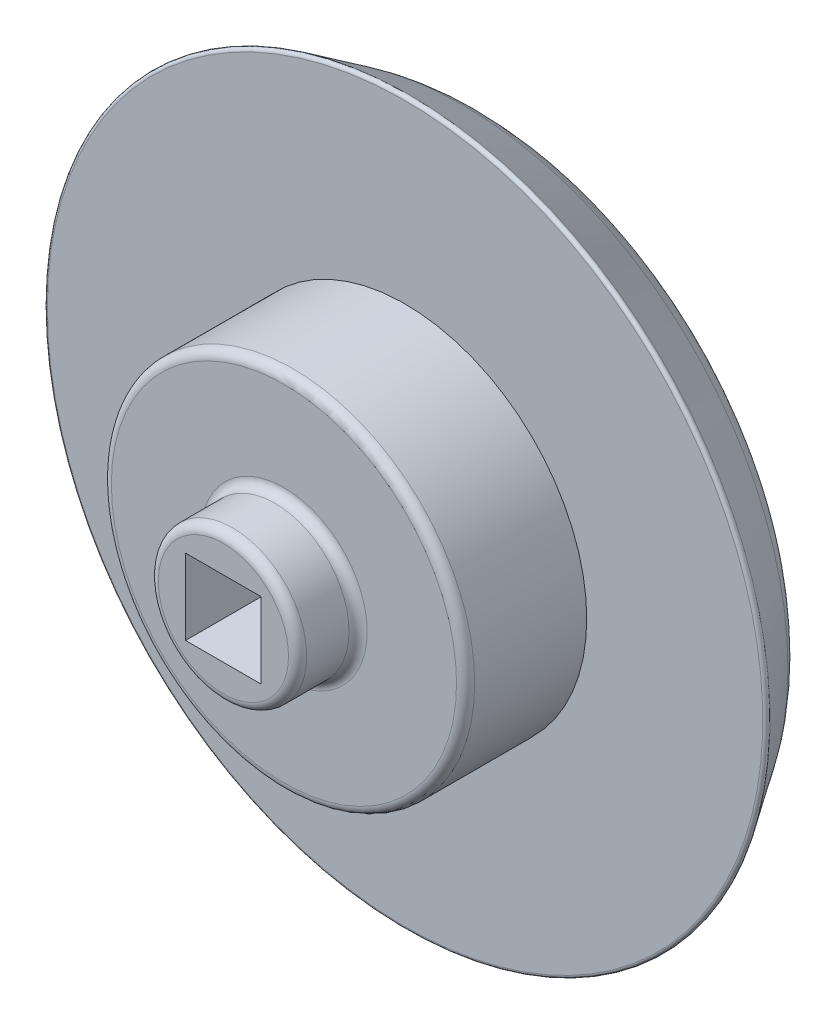
ISO-10303-21;
HEADER;
FILE_DESCRIPTION(('STEP AP214'),'2;1');
FILE_NAME('part.step','',(''),(''),'','','');
FILE_SCHEMA(('AUTOMOTIVE_DESIGN { 1 0 10303 214 1 1 1 1 }'));
ENDSEC;
DATA;
#1=APPLICATION_CONTEXT('core data for automotive mechanical design processes');
#2=APPLICATION_PROTOCOL_DEFINITION('international standard','automotive_design',2000,#1);
#3=PRODUCT_CONTEXT('',#1,'mechanical');
#4=PRODUCT('Part','Part','',(#3));
#5=PRODUCT_RELATED_PRODUCT_CATEGORY('part','',(#4));
#6=PRODUCT_DEFINITION_FORMATION('','',#4);
#7=PRODUCT_DEFINITION_CONTEXT('part definition',#1,'design');
#8=PRODUCT_DEFINITION('design','',#6,#7);
#9=PRODUCT_DEFINITION_SHAPE('','',#8);
#10=(LENGTH_UNIT() NAMED_UNIT(*) SI_UNIT(.MILLI.,.METRE.));
#11=(NAMED_UNIT(*) PLANE_ANGLE_UNIT() SI_UNIT($,.RADIAN.));
#12=(NAMED_UNIT(*) SI_UNIT($,.STERADIAN.) SOLID_ANGLE_UNIT());
#13=UNCERTAINTY_MEASURE_WITH_UNIT(LENGTH_MEASURE(1.E-05),#10,'distance_accuracy_value','');
#14=(GEOMETRIC_REPRESENTATION_CONTEXT(3) GLOBAL_UNCERTAINTY_ASSIGNED_CONTEXT((#13)) GLOBAL_UNIT_ASSIGNED_CONTEXT((#10,
#11,#12)) REPRESENTATION_CONTEXT('',''));
#15=CARTESIAN_POINT('',(0.,0.,0.));
#16=DIRECTION('',(0.,0.,1.));
#17=DIRECTION('',(1.,0.,0.));
#18=AXIS2_PLACEMENT_3D('',#15,#16,#17);
#19=CARTESIAN_POINT('',(25.4,0.,-5.68302158273383));
#20=DIRECTION('',(0.,0.,1.));
#21=DIRECTION('',(1.,0.,0.));
#22=AXIS2_PLACEMENT_3D('',#19,#20,#21);
#23=PLANE('',#22);
#24=CARTESIAN_POINT('',(0.,0.,-5.68302158273382));
#25=DIRECTION('',(0.,0.,1.));
#26=DIRECTION('',(1.,0.,0.));
#27=AXIS2_PLACEMENT_3D('',#24,#25,#26);
#28=CIRCLE('',#27,22.1375198082572);
#29=CARTESIAN_POINT('',(22.1375198082572,0.,-5.68302158273382));
#30=VERTEX_POINT('',#29);
#31=EDGE_CURVE('E124',#30,#30,#28,.F.);
#32=ORIENTED_EDGE('',*,*,#31,.T.);
#33=EDGE_LOOP('',(#32));
#34=FACE_BOUND('',#33,.T.);
#35=CARTESIAN_POINT('',(0.,0.,-5.68302158273382));
#36=DIRECTION('',(0.,0.,-1.));
#37=DIRECTION('',(-1.,0.,0.));
#38=AXIS2_PLACEMENT_3D('',#35,#36,#37);
#39=CIRCLE('',#38,12.7);
#40=CARTESIAN_POINT('',(-12.7,0.,-5.68302158273382));
#41=VERTEX_POINT('',#40);
#42=EDGE_CURVE('E113',#41,#41,#39,.T.);
#43=ORIENTED_EDGE('',*,*,#42,.F.);
#44=EDGE_LOOP('',(#43));
#45=FACE_BOUND('',#44,.T.);
#46=ADVANCED_FACE('F37',(#34,#45),#23,.F.);
#47=CARTESIAN_POINT('',(0.,0.,1.93697841726618));
#48=DIRECTION('',(0.,0.,-1.));
#49=DIRECTION('',(-1.,0.,0.));
#50=AXIS2_PLACEMENT_3D('',#47,#48,#49);
#51=PLANE('',#50);
#52=CARTESIAN_POINT('',(0.,0.,1.93697841726618));
#53=DIRECTION('',(0.,0.,-1.));
#54=DIRECTION('',(-1.,0.,0.));
#55=AXIS2_PLACEMENT_3D('',#52,#53,#54);
#56=CIRCLE('',#55,30.0053966586774);
#57=CARTESIAN_POINT('',(-30.0053966586774,0.,1.93697841726618));
#58=VERTEX_POINT('',#57);
#59=EDGE_CURVE('E11',#58,#58,#56,.F.);
#60=ORIENTED_EDGE('',*,*,#59,.T.);
#61=EDGE_LOOP('',(#60));
#62=FACE_BOUND('',#61,.T.);
#63=CARTESIAN_POINT('',(0.,0.,1.93697841726618));
#64=DIRECTION('',(0.,0.,1.));
#65=DIRECTION('',(1.,0.,0.));
#66=AXIS2_PLACEMENT_3D('',#63,#64,#65);
#67=CIRCLE('',#66,15.24);
#68=CARTESIAN_POINT('',(15.24,0.,1.93697841726618));
#69=VERTEX_POINT('',#68);
#70=EDGE_CURVE('E119',#69,#69,#67,.T.);
#71=ORIENTED_EDGE('',*,*,#70,.F.);
#72=EDGE_LOOP('',(#71));
#73=FACE_BOUND('',#72,.T.);
#74=ADVANCED_FACE('F167',(#62,#73),#51,.F.);
#75=CARTESIAN_POINT('',(0.,0.,1.93697841726618));
#76=DIRECTION('',(0.,0.,1.));
#77=DIRECTION('',(1.,0.,0.));
#78=AXIS2_PLACEMENT_3D('',#75,#76,#77);
#79=CONICAL_SURFACE('',#78,30.48,0.588002603547567);
#80=CARTESIAN_POINT('',(0.,0.,1.54208456742497));
#81=DIRECTION('',(0.,0.,-1.));
#82=DIRECTION('',(-1.,0.,0.));
#83=AXIS2_PLACEMENT_3D('',#80,#81,#82);
#84=CIRCLE('',#83,30.2167374334392);
#85=CARTESIAN_POINT('',(-30.2167374334392,0.,1.54208456742497));
#86=VERTEX_POINT('',#85);
#87=EDGE_CURVE('E45',#86,#86,#84,.T.);
#88=ORIENTED_EDGE('',*,*,#87,.T.);
#89=EDGE_LOOP('',(#88));
#90=FACE_BOUND('',#89,.T.);
#91=CARTESIAN_POINT('',(0.,0.,-2.96847397892282));
#92=DIRECTION('',(0.,0.,-1.));
#93=DIRECTION('',(-1.,0.,0.));
#94=AXIS2_PLACEMENT_3D('',#91,#92,#93);
#95=CIRCLE('',#94,27.2096984025407);
#96=CARTESIAN_POINT('',(-27.2096984025407,0.,-2.96847397892281));
#97=VERTEX_POINT('',#96);
#98=EDGE_CURVE('E127',#97,#97,#95,.F.);
#99=ORIENTED_EDGE('',*,*,#98,.T.);
#100=EDGE_LOOP('',(#99));
#101=FACE_BOUND('',#100,.T.);
#102=ADVANCED_FACE('F150',(#90,#101),#79,.T.);
#103=CARTESIAN_POINT('',(0.,0.,12.0969784172662));
#104=DIRECTION('',(0.,0.,-1.));
#105=DIRECTION('',(-1.,0.,0.));
#106=AXIS2_PLACEMENT_3D('',#103,#104,#105);
#107=CYLINDRICAL_SURFACE('',#106,15.24);
#108=CARTESIAN_POINT('',(0.,0.,11.3349784172662));
#109=DIRECTION('',(0.,0.,1.));
#110=DIRECTION('',(1.,0.,0.));
#111=AXIS2_PLACEMENT_3D('',#108,#109,#110);
#112=CIRCLE('',#111,15.24);
#113=CARTESIAN_POINT('',(15.24,0.,11.3349784172662));
#114=VERTEX_POINT('',#113);
#115=EDGE_CURVE('E145',#114,#114,#112,.F.);
#116=ORIENTED_EDGE('',*,*,#115,.T.);
#117=EDGE_LOOP('',(#116));
#118=FACE_BOUND('',#117,.T.);
#119=ORIENTED_EDGE('',*,*,#70,.T.);
#120=EDGE_LOOP('',(#119));
#121=FACE_BOUND('',#120,.T.);
#122=ADVANCED_FACE('F208',(#118,#121),#107,.T.);
#123=CARTESIAN_POINT('',(0.,0.,12.0969784172662));
#124=DIRECTION('',(0.,0.,1.));
#125=DIRECTION('',(1.,0.,0.));
#126=AXIS2_PLACEMENT_3D('',#123,#124,#125);
#127=PLANE('',#126);
#128=CARTESIAN_POINT('',(0.,0.,12.0969784172662));
#129=DIRECTION('',(0.,0.,1.));
#130=DIRECTION('',(1.,0.,0.));
#131=AXIS2_PLACEMENT_3D('',#128,#129,#130);
#132=CIRCLE('',#131,6.9860577826327);
#133=CARTESIAN_POINT('',(6.9860577826327,0.,12.0969784172662));
#134=VERTEX_POINT('',#133);
#135=EDGE_CURVE('E142',#134,#134,#132,.F.);
#136=ORIENTED_EDGE('',*,*,#135,.T.);
#137=EDGE_LOOP('',(#136));
#138=FACE_BOUND('',#137,.T.);
#139=CARTESIAN_POINT('',(0.,0.,12.0969784172662));
#140=DIRECTION('',(0.,0.,1.));
#141=DIRECTION('',(1.,0.,0.));
#142=AXIS2_PLACEMENT_3D('',#139,#140,#141);
#143=CIRCLE('',#142,14.478);
#144=CARTESIAN_POINT('',(14.478,0.,12.0969784172662));
#145=VERTEX_POINT('',#144);
#146=EDGE_CURVE('E139',#145,#145,#143,.T.);
#147=ORIENTED_EDGE('',*,*,#146,.T.);
#148=EDGE_LOOP('',(#147));
#149=FACE_BOUND('',#148,.T.);
#150=ADVANCED_FACE('F198',(#138,#149),#127,.T.);
#151=CARTESIAN_POINT('',(0.,0.,17.1769784172662));
#152=DIRECTION('',(0.,0.,-1.));
#153=DIRECTION('',(-1.,0.,0.));
#154=AXIS2_PLACEMENT_3D('',#151,#152,#153);
#155=CYLINDRICAL_SURFACE('',#154,6.2240577826327);
#156=CARTESIAN_POINT('',(0.,0.,16.4149784172662));
#157=DIRECTION('',(0.,0.,1.));
#158=DIRECTION('',(1.,0.,0.));
#159=AXIS2_PLACEMENT_3D('',#156,#157,#158);
#160=CIRCLE('',#159,6.2240577826327);
#161=CARTESIAN_POINT('',(6.2240577826327,0.,16.4149784172662));
#162=VERTEX_POINT('',#161);
#163=EDGE_CURVE('E136',#162,#162,#160,.F.);
#164=ORIENTED_EDGE('',*,*,#163,.T.);
#165=EDGE_LOOP('',(#164));
#166=FACE_BOUND('',#165,.T.);
#167=CARTESIAN_POINT('',(0.,0.,12.8589784172662));
#168=DIRECTION('',(0.,0.,1.));
#169=DIRECTION('',(1.,0.,0.));
#170=AXIS2_PLACEMENT_3D('',#167,#168,#169);
#171=CIRCLE('',#170,6.2240577826327);
#172=CARTESIAN_POINT('',(6.2240577826327,0.,12.8589784172662));
#173=VERTEX_POINT('',#172);
#174=EDGE_CURVE('E133',#173,#173,#171,.T.);
#175=ORIENTED_EDGE('',*,*,#174,.T.);
#176=EDGE_LOOP('',(#175));
#177=FACE_BOUND('',#176,.T.);
#178=ADVANCED_FACE('F195',(#166,#177),#155,.T.);
#179=CARTESIAN_POINT('',(0.,0.,17.1769784172662));
#180=DIRECTION('',(0.,0.,1.));
#181=DIRECTION('',(1.,0.,0.));
#182=AXIS2_PLACEMENT_3D('',#179,#180,#181);
#183=PLANE('',#182);
#184=DIRECTION('',(0.,-1.,0.));
#185=VECTOR('',#184,1.);
#186=CARTESIAN_POINT('',(-3.175,3.175,17.1769784172662));
#187=LINE('',#186,#185);
#188=CARTESIAN_POINT('',(-3.175,3.175,17.1769784172662));
#189=VERTEX_POINT('',#188);
#190=CARTESIAN_POINT('',(-3.175,-3.175,17.1769784172662));
#191=VERTEX_POINT('',#190);
#192=EDGE_CURVE('E52',#189,#191,#187,.T.);
#193=ORIENTED_EDGE('',*,*,#192,.F.);
#194=DIRECTION('',(-1.,0.,0.));
#195=VECTOR('',#194,1.);
#196=CARTESIAN_POINT('',(-3.175,3.175,17.1769784172662));
#197=LINE('',#196,#195);
#198=CARTESIAN_POINT('',(3.175,3.175,17.1769784172662));
#199=VERTEX_POINT('',#198);
#200=EDGE_CURVE('E103',#199,#189,#197,.T.);
#201=ORIENTED_EDGE('',*,*,#200,.F.);
#202=DIRECTION('',(0.,1.,0.));
#203=VECTOR('',#202,1.);
#204=CARTESIAN_POINT('',(3.175,3.175,17.1769784172662));
#205=LINE('',#204,#203);
#206=CARTESIAN_POINT('',(3.175,-3.175,17.1769784172662));
#207=VERTEX_POINT('',#206);
#208=EDGE_CURVE('E109',#207,#199,#205,.T.);
#209=ORIENTED_EDGE('',*,*,#208,.F.);
#210=DIRECTION('',(1.,0.,0.));
#211=VECTOR('',#210,1.);
#212=CARTESIAN_POINT('',(-3.175,-3.175,17.1769784172662));
#213=LINE('',#212,#211);
#214=EDGE_CURVE('E87',#191,#207,#213,.T.);
#215=ORIENTED_EDGE('',*,*,#214,.F.);
#216=EDGE_LOOP('',(#193,#201,#209,#215));
#217=FACE_BOUND('',#216,.T.);
#218=CARTESIAN_POINT('',(0.,0.,17.1769784172662));
#219=DIRECTION('',(0.,0.,1.));
#220=DIRECTION('',(1.,0.,0.));
#221=AXIS2_PLACEMENT_3D('',#218,#219,#220);
#222=CIRCLE('',#221,5.4620577826327);
#223=CARTESIAN_POINT('',(5.4620577826327,0.,17.1769784172662));
#224=VERTEX_POINT('',#223);
#225=EDGE_CURVE('E130',#224,#224,#222,.T.);
#226=ORIENTED_EDGE('',*,*,#225,.T.);
#227=EDGE_LOOP('',(#226));
#228=FACE_BOUND('',#227,.T.);
#229=ADVANCED_FACE('F197',(#217,#228),#183,.T.);
#230=CARTESIAN_POINT('',(0.,0.,-0.603021582733823));
#231=DIRECTION('',(0.,0.,-1.));
#232=DIRECTION('',(-1.,0.,0.));
#233=AXIS2_PLACEMENT_3D('',#230,#231,#232);
#234=CYLINDRICAL_SURFACE('',#233,12.7);
#235=CARTESIAN_POINT('',(0.,0.,-0.603021582733823));
#236=DIRECTION('',(0.,0.,-1.));
#237=DIRECTION('',(-1.,0.,0.));
#238=AXIS2_PLACEMENT_3D('',#235,#236,#237);
#239=CIRCLE('',#238,12.7);
#240=CARTESIAN_POINT('',(-12.7,0.,-0.603021582733823));
#241=VERTEX_POINT('',#240);
#242=EDGE_CURVE('E116',#241,#241,#239,.T.);
#243=ORIENTED_EDGE('',*,*,#242,.F.);
#244=EDGE_LOOP('',(#243));
#245=FACE_BOUND('',#244,.T.);
#246=ORIENTED_EDGE('',*,*,#42,.T.);
#247=EDGE_LOOP('',(#246));
#248=FACE_BOUND('',#247,.T.);
#249=ADVANCED_FACE('F205',(#245,#248),#234,.F.);
#250=CARTESIAN_POINT('',(0.,0.,-0.603021582733823));
#251=DIRECTION('',(0.,0.,-1.));
#252=DIRECTION('',(-1.,0.,0.));
#253=AXIS2_PLACEMENT_3D('',#250,#251,#252);
#254=PLANE('',#253);
#255=ORIENTED_EDGE('',*,*,#242,.T.);
#256=EDGE_LOOP('',(#255));
#257=FACE_BOUND('',#256,.T.);
#258=ADVANCED_FACE('F182',(#257),#254,.T.);
#259=CARTESIAN_POINT('',(0.,0.,0.412978417266177));
#260=DIRECTION('',(0.,0.,1.));
#261=DIRECTION('',(1.,0.,0.));
#262=AXIS2_PLACEMENT_3D('',#259,#260,#261);
#263=TOROIDAL_SURFACE('',#262,22.1375198082572,6.096);
#264=ORIENTED_EDGE('',*,*,#98,.F.);
#265=EDGE_LOOP('',(#264));
#266=FACE_BOUND('',#265,.T.);
#267=ORIENTED_EDGE('',*,*,#31,.F.);
#268=EDGE_LOOP('',(#267));
#269=FACE_BOUND('',#268,.T.);
#270=ADVANCED_FACE('F178',(#266,#269),#263,.T.);
#271=CARTESIAN_POINT('',(0.,0.,16.4149784172662));
#272=DIRECTION('',(0.,0.,1.));
#273=DIRECTION('',(1.,0.,0.));
#274=AXIS2_PLACEMENT_3D('',#271,#272,#273);
#275=TOROIDAL_SURFACE('',#274,5.4620577826327,0.762);
#276=ORIENTED_EDGE('',*,*,#163,.F.);
#277=EDGE_LOOP('',(#276));
#278=FACE_BOUND('',#277,.T.);
#279=ORIENTED_EDGE('',*,*,#225,.F.);
#280=EDGE_LOOP('',(#279));
#281=FACE_BOUND('',#280,.T.);
#282=ADVANCED_FACE('F181',(#278,#281),#275,.T.);
#283=CARTESIAN_POINT('',(0.,0.,12.8589784172662));
#284=DIRECTION('',(0.,0.,1.));
#285=DIRECTION('',(1.,0.,0.));
#286=AXIS2_PLACEMENT_3D('',#283,#284,#285);
#287=TOROIDAL_SURFACE('',#286,6.9860577826327,0.762);
#288=ORIENTED_EDGE('',*,*,#135,.F.);
#289=EDGE_LOOP('',(#288));
#290=FACE_BOUND('',#289,.T.);
#291=ORIENTED_EDGE('',*,*,#174,.F.);
#292=EDGE_LOOP('',(#291));
#293=FACE_BOUND('',#292,.T.);
#294=ADVANCED_FACE('F163',(#290,#293),#287,.F.);
#295=CARTESIAN_POINT('',(0.,0.,11.3349784172662));
#296=DIRECTION('',(0.,0.,1.));
#297=DIRECTION('',(1.,0.,0.));
#298=AXIS2_PLACEMENT_3D('',#295,#296,#297);
#299=TOROIDAL_SURFACE('',#298,14.478,0.762);
#300=ORIENTED_EDGE('',*,*,#115,.F.);
#301=EDGE_LOOP('',(#300));
#302=FACE_BOUND('',#301,.T.);
#303=ORIENTED_EDGE('',*,*,#146,.F.);
#304=EDGE_LOOP('',(#303));
#305=FACE_BOUND('',#304,.T.);
#306=ADVANCED_FACE('F155',(#302,#305),#299,.T.);
#307=CARTESIAN_POINT('',(0.,0.,1.68297841726618));
#308=DIRECTION('',(0.,0.,-1.));
#309=DIRECTION('',(-1.,0.,0.));
#310=AXIS2_PLACEMENT_3D('',#307,#308,#309);
#311=TOROIDAL_SURFACE('',#310,30.0053966586774,0.254);
#312=ORIENTED_EDGE('',*,*,#59,.F.);
#313=EDGE_LOOP('',(#312));
#314=FACE_BOUND('',#313,.T.);
#315=ORIENTED_EDGE('',*,*,#87,.F.);
#316=EDGE_LOOP('',(#315));
#317=FACE_BOUND('',#316,.T.);
#318=ADVANCED_FACE('F39',(#314,#317),#311,.T.);
#319=CARTESIAN_POINT('',(-3.175,3.175,6.17697841726618));
#320=DIRECTION('',(-1.,0.,0.));
#321=DIRECTION('',(0.,-1.,0.));
#322=AXIS2_PLACEMENT_3D('',#319,#320,#321);
#323=PLANE('',#322);
#324=ORIENTED_EDGE('',*,*,#192,.T.);
#325=DIRECTION('',(0.,0.,1.));
#326=VECTOR('',#325,1.);
#327=CARTESIAN_POINT('',(-3.175,-3.175,6.17697841726618));
#328=LINE('',#327,#326);
#329=CARTESIAN_POINT('',(-3.175,-3.175,6.17697841726618));
#330=VERTEX_POINT('',#329);
#331=EDGE_CURVE('E75',#330,#191,#328,.T.);
#332=ORIENTED_EDGE('',*,*,#331,.F.);
#333=DIRECTION('',(0.,-1.,0.));
#334=VECTOR('',#333,1.);
#335=CARTESIAN_POINT('',(-3.175,3.175,6.17697841726618));
#336=LINE('',#335,#334);
#337=CARTESIAN_POINT('',(-3.175,3.175,6.17697841726618));
#338=VERTEX_POINT('',#337);
#339=EDGE_CURVE('E101',#338,#330,#336,.T.);
#340=ORIENTED_EDGE('',*,*,#339,.F.);
#341=DIRECTION('',(0.,0.,1.));
#342=VECTOR('',#341,1.);
#343=CARTESIAN_POINT('',(-3.175,3.175,6.17697841726618));
#344=LINE('',#343,#342);
#345=EDGE_CURVE('E60',#338,#189,#344,.T.);
#346=ORIENTED_EDGE('',*,*,#345,.T.);
#347=EDGE_LOOP('',(#324,#332,#340,#346));
#348=FACE_BOUND('',#347,.T.);
#349=ADVANCED_FACE('F154',(#348),#323,.F.);
#350=CARTESIAN_POINT('',(-3.175,3.175,6.17697841726618));
#351=DIRECTION('',(0.,1.,0.));
#352=DIRECTION('',(0.,0.,1.));
#353=AXIS2_PLACEMENT_3D('',#350,#351,#352);
#354=PLANE('',#353);
#355=ORIENTED_EDGE('',*,*,#200,.T.);
#356=ORIENTED_EDGE('',*,*,#345,.F.);
#357=DIRECTION('',(-1.,0.,0.));
#358=VECTOR('',#357,1.);
#359=CARTESIAN_POINT('',(-3.175,3.175,6.17697841726618));
#360=LINE('',#359,#358);
#361=CARTESIAN_POINT('',(3.175,3.175,6.17697841726618));
#362=VERTEX_POINT('',#361);
#363=EDGE_CURVE('E98',#362,#338,#360,.T.);
#364=ORIENTED_EDGE('',*,*,#363,.F.);
#365=DIRECTION('',(0.,0.,1.));
#366=VECTOR('',#365,1.);
#367=CARTESIAN_POINT('',(3.175,3.175,6.17697841726618));
#368=LINE('',#367,#366);
#369=EDGE_CURVE('E91',#362,#199,#368,.T.);
#370=ORIENTED_EDGE('',*,*,#369,.T.);
#371=EDGE_LOOP('',(#355,#356,#364,#370));
#372=FACE_BOUND('',#371,.T.);
#373=ADVANCED_FACE('F161',(#372),#354,.F.);
#374=CARTESIAN_POINT('',(3.175,3.175,6.17697841726618));
#375=DIRECTION('',(1.,0.,0.));
#376=DIRECTION('',(0.,1.,0.));
#377=AXIS2_PLACEMENT_3D('',#374,#375,#376);
#378=PLANE('',#377);
#379=ORIENTED_EDGE('',*,*,#208,.T.);
#380=ORIENTED_EDGE('',*,*,#369,.F.);
#381=DIRECTION('',(0.,1.,0.));
#382=VECTOR('',#381,1.);
#383=CARTESIAN_POINT('',(3.175,3.175,6.17697841726618));
#384=LINE('',#383,#382);
#385=CARTESIAN_POINT('',(3.175,-3.175,6.17697841726618));
#386=VERTEX_POINT('',#385);
#387=EDGE_CURVE('E94',#386,#362,#384,.T.);
#388=ORIENTED_EDGE('',*,*,#387,.F.);
#389=DIRECTION('',(0.,0.,1.));
#390=VECTOR('',#389,1.);
#391=CARTESIAN_POINT('',(3.175,-3.175,6.17697841726618));
#392=LINE('',#391,#390);
#393=EDGE_CURVE('E80',#386,#207,#392,.T.);
#394=ORIENTED_EDGE('',*,*,#393,.T.);
#395=EDGE_LOOP('',(#379,#380,#388,#394));
#396=FACE_BOUND('',#395,.T.);
#397=ADVANCED_FACE('F95',(#396),#378,.F.);
#398=CARTESIAN_POINT('',(-3.175,-3.175,6.17697841726618));
#399=DIRECTION('',(0.,-1.,0.));
#400=DIRECTION('',(0.,0.,-1.));
#401=AXIS2_PLACEMENT_3D('',#398,#399,#400);
#402=PLANE('',#401);
#403=ORIENTED_EDGE('',*,*,#214,.T.);
#404=ORIENTED_EDGE('',*,*,#393,.F.);
#405=DIRECTION('',(1.,0.,0.));
#406=VECTOR('',#405,1.);
#407=CARTESIAN_POINT('',(-3.175,-3.175,6.17697841726618));
#408=LINE('',#407,#406);
#409=EDGE_CURVE('E84',#330,#386,#408,.T.);
#410=ORIENTED_EDGE('',*,*,#409,.F.);
#411=ORIENTED_EDGE('',*,*,#331,.T.);
#412=EDGE_LOOP('',(#403,#404,#410,#411));
#413=FACE_BOUND('',#412,.T.);
#414=ADVANCED_FACE('F82',(#413),#402,.F.);
#415=CARTESIAN_POINT('',(0.,0.,6.17697841726618));
#416=DIRECTION('',(0.,0.,1.));
#417=DIRECTION('',(1.,0.,0.));
#418=AXIS2_PLACEMENT_3D('',#415,#416,#417);
#419=PLANE('',#418);
#420=ORIENTED_EDGE('',*,*,#339,.T.);
#421=ORIENTED_EDGE('',*,*,#409,.T.);
#422=ORIENTED_EDGE('',*,*,#387,.T.);
#423=ORIENTED_EDGE('',*,*,#363,.T.);
#424=EDGE_LOOP('',(#420,#421,#422,#423));
#425=FACE_BOUND('',#424,.T.);
#426=ADVANCED_FACE('F100',(#425),#419,.T.);
#427=CLOSED_SHELL('',(#46,#74,#102,#122,#150,#178,#229,#249,#258,#270,#282,#294,#306,#318,#349,
#373,#397,#414,#426));
#428=MANIFOLD_SOLID_BREP('B2',#427);
#429=ADVANCED_BREP_SHAPE_REPRESENTATION('',(#18,#428),#14);
#430=SHAPE_DEFINITION_REPRESENTATION(#9,#429);
ENDSEC;
END-ISO-10303-21;
